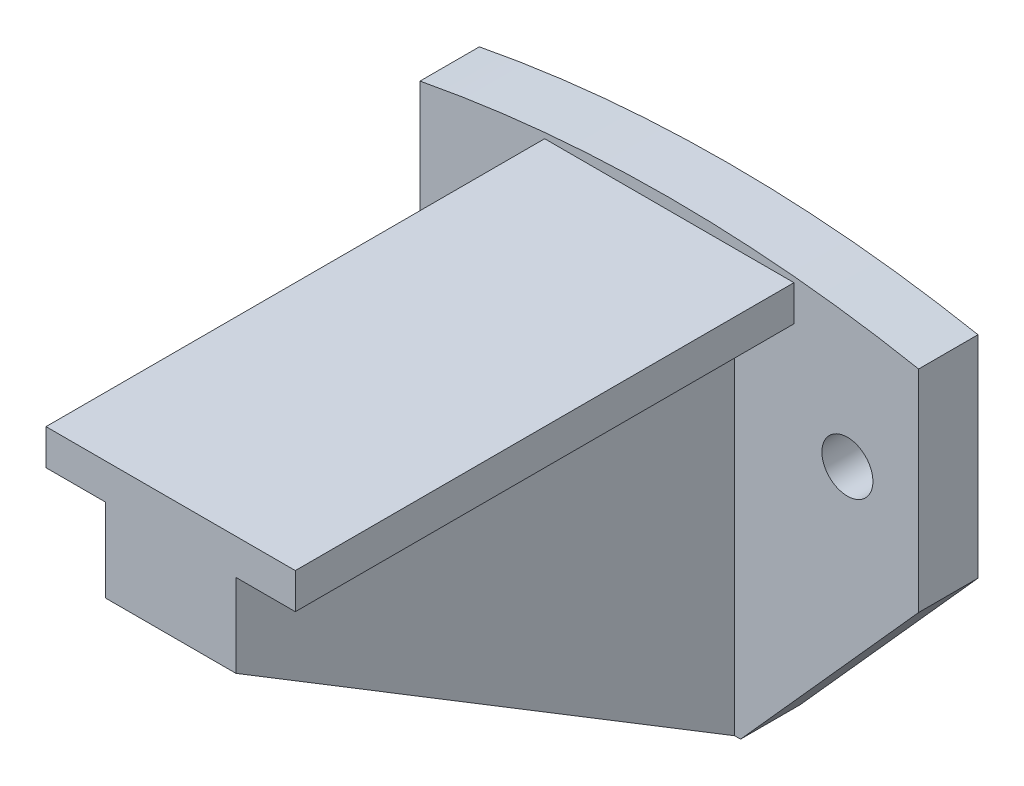
ISO-10303-21;
HEADER;
FILE_DESCRIPTION(('STEP AP214'),'2;1');
FILE_NAME('part.step','',(''),(''),'','','');
FILE_SCHEMA(('AUTOMOTIVE_DESIGN { 1 0 10303 214 1 1 1 1 }'));
ENDSEC;
DATA;
#1=APPLICATION_CONTEXT('core data for automotive mechanical design processes');
#2=APPLICATION_PROTOCOL_DEFINITION('international standard','automotive_design',2000,#1);
#3=PRODUCT_CONTEXT('',#1,'mechanical');
#4=PRODUCT('Part','Part','',(#3));
#5=PRODUCT_RELATED_PRODUCT_CATEGORY('part','',(#4));
#6=PRODUCT_DEFINITION_FORMATION('','',#4);
#7=PRODUCT_DEFINITION_CONTEXT('part definition',#1,'design');
#8=PRODUCT_DEFINITION('design','',#6,#7);
#9=PRODUCT_DEFINITION_SHAPE('','',#8);
#10=(LENGTH_UNIT() NAMED_UNIT(*) SI_UNIT(.MILLI.,.METRE.));
#11=(NAMED_UNIT(*) PLANE_ANGLE_UNIT() SI_UNIT($,.RADIAN.));
#12=(NAMED_UNIT(*) SI_UNIT($,.STERADIAN.) SOLID_ANGLE_UNIT());
#13=UNCERTAINTY_MEASURE_WITH_UNIT(LENGTH_MEASURE(1.E-05),#10,'distance_accuracy_value','');
#14=(GEOMETRIC_REPRESENTATION_CONTEXT(3) GLOBAL_UNCERTAINTY_ASSIGNED_CONTEXT((#13)) GLOBAL_UNIT_ASSIGNED_CONTEXT((#10,
#11,#12)) REPRESENTATION_CONTEXT('',''));
#15=CARTESIAN_POINT('',(0.,0.,0.));
#16=DIRECTION('',(0.,0.,1.));
#17=DIRECTION('',(1.,0.,0.));
#18=AXIS2_PLACEMENT_3D('',#15,#16,#17);
#19=CARTESIAN_POINT('',(0.,0.,0.));
#20=DIRECTION('',(0.,0.,-1.));
#21=DIRECTION('',(-1.,0.,0.));
#22=AXIS2_PLACEMENT_3D('',#19,#20,#21);
#23=PLANE('',#22);
#24=CARTESIAN_POINT('',(-15.,-4.37207546984478,0.));
#25=DIRECTION('',(0.,0.,-1.));
#26=DIRECTION('',(-1.,0.,0.));
#27=AXIS2_PLACEMENT_3D('',#24,#25,#26);
#28=CIRCLE('',#27,2.15);
#29=CARTESIAN_POINT('',(-17.15,-4.37207546984478,0.));
#30=VERTEX_POINT('',#29);
#31=EDGE_CURVE('E248',#30,#30,#28,.T.);
#32=ORIENTED_EDGE('',*,*,#31,.T.);
#33=EDGE_LOOP('',(#32));
#34=FACE_BOUND('',#33,.T.);
#35=DIRECTION('',(1.,0.,0.));
#36=VECTOR('',#35,1.);
#37=CARTESIAN_POINT('',(0.,-28.75,0.));
#38=LINE('',#37,#36);
#39=CARTESIAN_POINT('',(-6.,-28.75,0.));
#40=VERTEX_POINT('',#39);
#41=CARTESIAN_POINT('',(-5.49999999999963,-28.7500000000002,0.));
#42=VERTEX_POINT('',#41);
#43=EDGE_CURVE('E225',#40,#42,#38,.T.);
#44=ORIENTED_EDGE('',*,*,#43,.T.);
#45=DIRECTION('',(0.,-1.,0.));
#46=VECTOR('',#45,1.);
#47=CARTESIAN_POINT('',(-5.4999999999999,-3.20000000000006,0.));
#48=LINE('',#47,#46);
#49=CARTESIAN_POINT('',(-5.49999999999997,3.79999999999989,0.));
#50=VERTEX_POINT('',#49);
#51=EDGE_CURVE('E58',#50,#42,#48,.T.);
#52=ORIENTED_EDGE('',*,*,#51,.F.);
#53=DIRECTION('',(1.,0.,0.));
#54=VECTOR('',#53,1.);
#55=CARTESIAN_POINT('',(-5.49999999999997,3.79999999999989,0.));
#56=LINE('',#55,#54);
#57=CARTESIAN_POINT('',(-10.5,3.79999999999989,0.));
#58=VERTEX_POINT('',#57);
#59=EDGE_CURVE('E54',#58,#50,#56,.T.);
#60=ORIENTED_EDGE('',*,*,#59,.F.);
#61=DIRECTION('',(0.,-1.,0.));
#62=VECTOR('',#61,1.);
#63=CARTESIAN_POINT('',(-10.5,6.7999999999999,0.));
#64=LINE('',#63,#62);
#65=CARTESIAN_POINT('',(-10.5,6.7999999999999,0.));
#66=VERTEX_POINT('',#65);
#67=EDGE_CURVE('E11',#66,#58,#64,.T.);
#68=ORIENTED_EDGE('',*,*,#67,.F.);
#69=DIRECTION('',(-1.,0.,0.));
#70=VECTOR('',#69,1.);
#71=CARTESIAN_POINT('',(-10.5,6.7999999999999,0.));
#72=LINE('',#71,#70);
#73=CARTESIAN_POINT('',(10.5,6.7999999999999,0.));
#74=VERTEX_POINT('',#73);
#75=EDGE_CURVE('E203',#74,#66,#72,.T.);
#76=ORIENTED_EDGE('',*,*,#75,.F.);
#77=DIRECTION('',(0.,1.,0.));
#78=VECTOR('',#77,1.);
#79=CARTESIAN_POINT('',(10.5,6.7999999999999,0.));
#80=LINE('',#79,#78);
#81=CARTESIAN_POINT('',(10.5,3.79999999999989,0.));
#82=VERTEX_POINT('',#81);
#83=EDGE_CURVE('E201',#82,#74,#80,.T.);
#84=ORIENTED_EDGE('',*,*,#83,.F.);
#85=DIRECTION('',(1.,0.,0.));
#86=VECTOR('',#85,1.);
#87=CARTESIAN_POINT('',(10.5,3.79999999999989,0.));
#88=LINE('',#87,#86);
#89=CARTESIAN_POINT('',(5.5000000000001,3.79999999999989,0.));
#90=VERTEX_POINT('',#89);
#91=EDGE_CURVE('E198',#90,#82,#88,.T.);
#92=ORIENTED_EDGE('',*,*,#91,.F.);
#93=DIRECTION('',(0.,1.,0.));
#94=VECTOR('',#93,1.);
#95=CARTESIAN_POINT('',(5.5000000000001,3.79999999999989,0.));
#96=LINE('',#95,#94);
#97=CARTESIAN_POINT('',(5.5000000000004,-28.7500000000001,0.));
#98=VERTEX_POINT('',#97);
#99=EDGE_CURVE('E195',#98,#90,#96,.T.);
#100=ORIENTED_EDGE('',*,*,#99,.F.);
#101=CARTESIAN_POINT('',(6.,-28.75,0.));
#102=VERTEX_POINT('',#101);
#103=EDGE_CURVE('E224',#98,#102,#38,.T.);
#104=ORIENTED_EDGE('',*,*,#103,.T.);
#105=DIRECTION('',(-0.667272616939326,-0.744813570420776,0.));
#106=VECTOR('',#105,1.);
#107=CARTESIAN_POINT('',(17.6170524107622,-15.7829786294649,0.));
#108=LINE('',#107,#106);
#109=CARTESIAN_POINT('',(21.,-12.0069128828382,0.));
#110=VERTEX_POINT('',#109);
#111=EDGE_CURVE('E233',#110,#102,#108,.T.);
#112=ORIENTED_EDGE('',*,*,#111,.F.);
#113=DIRECTION('',(0.,1.,0.));
#114=VECTOR('',#113,1.);
#115=CARTESIAN_POINT('',(21.,0.,0.));
#116=LINE('',#115,#114);
#117=CARTESIAN_POINT('',(21.,5.75473761123897,0.));
#118=VERTEX_POINT('',#117);
#119=EDGE_CURVE('E146',#110,#118,#116,.T.);
#120=ORIENTED_EDGE('',*,*,#119,.T.);
#121=CARTESIAN_POINT('',(0.,-103.240675136271,0.));
#122=DIRECTION('',(0.,0.,-1.));
#123=DIRECTION('',(-1.,0.,0.));
#124=AXIS2_PLACEMENT_3D('',#121,#122,#123);
#125=CIRCLE('',#124,111.);
#126=CARTESIAN_POINT('',(-21.,5.75473761123897,0.));
#127=VERTEX_POINT('',#126);
#128=EDGE_CURVE('E153',#127,#118,#125,.T.);
#129=ORIENTED_EDGE('',*,*,#128,.F.);
#130=DIRECTION('',(0.,-1.,0.));
#131=VECTOR('',#130,1.);
#132=CARTESIAN_POINT('',(-21.,0.,0.));
#133=LINE('',#132,#131);
#134=CARTESIAN_POINT('',(-21.,-12.0069128828382,0.));
#135=VERTEX_POINT('',#134);
#136=EDGE_CURVE('E138',#127,#135,#133,.T.);
#137=ORIENTED_EDGE('',*,*,#136,.T.);
#138=DIRECTION('',(-0.667272616939325,0.744813570420776,0.));
#139=VECTOR('',#138,1.);
#140=CARTESIAN_POINT('',(-17.6170524107622,-15.7829786294649,0.));
#141=LINE('',#140,#139);
#142=EDGE_CURVE('E239',#40,#135,#141,.T.);
#143=ORIENTED_EDGE('',*,*,#142,.F.);
#144=EDGE_LOOP('',(#44,#52,#60,#68,#76,#84,#92,#100,#104,#112,#120,#129,#137,#143));
#145=FACE_BOUND('',#144,.T.);
#146=CARTESIAN_POINT('',(15.,-4.37207546984478,0.));
#147=DIRECTION('',(0.,0.,-1.));
#148=DIRECTION('',(-1.,0.,0.));
#149=AXIS2_PLACEMENT_3D('',#146,#147,#148);
#150=CIRCLE('',#149,2.15);
#151=CARTESIAN_POINT('',(12.85,-4.37207546984478,0.));
#152=VERTEX_POINT('',#151);
#153=EDGE_CURVE('E147',#152,#152,#150,.T.);
#154=ORIENTED_EDGE('',*,*,#153,.T.);
#155=EDGE_LOOP('',(#154));
#156=FACE_BOUND('',#155,.T.);
#157=ADVANCED_FACE('F37',(#34,#145,#156),#23,.F.);
#158=CARTESIAN_POINT('',(-21.,0.,-5.));
#159=DIRECTION('',(-1.,0.,0.));
#160=DIRECTION('',(0.,-1.,0.));
#161=AXIS2_PLACEMENT_3D('',#158,#159,#160);
#162=PLANE('',#161);
#163=DIRECTION('',(0.,-1.,0.));
#164=VECTOR('',#163,1.);
#165=CARTESIAN_POINT('',(-21.,0.,-5.));
#166=LINE('',#165,#164);
#167=CARTESIAN_POINT('',(-21.,5.75473761123897,-5.));
#168=VERTEX_POINT('',#167);
#169=CARTESIAN_POINT('',(-21.,-12.0069128828382,-5.00000000000003));
#170=VERTEX_POINT('',#169);
#171=EDGE_CURVE('E258',#168,#170,#166,.T.);
#172=ORIENTED_EDGE('',*,*,#171,.T.);
#173=DIRECTION('',(0.,0.,1.));
#174=VECTOR('',#173,1.);
#175=CARTESIAN_POINT('',(-21.,-12.0069128828382,-101.682227319325));
#176=LINE('',#175,#174);
#177=EDGE_CURVE('E143',#170,#135,#176,.T.);
#178=ORIENTED_EDGE('',*,*,#177,.T.);
#179=ORIENTED_EDGE('',*,*,#136,.F.);
#180=DIRECTION('',(0.,0.,-1.));
#181=VECTOR('',#180,1.);
#182=CARTESIAN_POINT('',(-21.,5.75473761123897,0.));
#183=LINE('',#182,#181);
#184=EDGE_CURVE('E141',#127,#168,#183,.T.);
#185=ORIENTED_EDGE('',*,*,#184,.T.);
#186=EDGE_LOOP('',(#172,#178,#179,#185));
#187=FACE_BOUND('',#186,.T.);
#188=ADVANCED_FACE('F39',(#187),#162,.T.);
#189=CARTESIAN_POINT('',(21.,0.,-5.));
#190=DIRECTION('',(1.,0.,0.));
#191=DIRECTION('',(0.,1.,0.));
#192=AXIS2_PLACEMENT_3D('',#189,#190,#191);
#193=PLANE('',#192);
#194=ORIENTED_EDGE('',*,*,#119,.F.);
#195=DIRECTION('',(0.,0.,1.));
#196=VECTOR('',#195,1.);
#197=CARTESIAN_POINT('',(21.,-12.0069128828382,-101.682227319325));
#198=LINE('',#197,#196);
#199=CARTESIAN_POINT('',(21.,-12.0069128828382,-5.00000000000003));
#200=VERTEX_POINT('',#199);
#201=EDGE_CURVE('E227',#200,#110,#198,.T.);
#202=ORIENTED_EDGE('',*,*,#201,.F.);
#203=DIRECTION('',(0.,1.,0.));
#204=VECTOR('',#203,1.);
#205=CARTESIAN_POINT('',(21.,0.,-5.));
#206=LINE('',#205,#204);
#207=CARTESIAN_POINT('',(21.,5.75473761123897,-5.));
#208=VERTEX_POINT('',#207);
#209=EDGE_CURVE('E260',#200,#208,#206,.T.);
#210=ORIENTED_EDGE('',*,*,#209,.T.);
#211=DIRECTION('',(0.,0.,-1.));
#212=VECTOR('',#211,1.);
#213=CARTESIAN_POINT('',(21.,5.75473761123897,0.));
#214=LINE('',#213,#212);
#215=EDGE_CURVE('E156',#118,#208,#214,.T.);
#216=ORIENTED_EDGE('',*,*,#215,.F.);
#217=EDGE_LOOP('',(#194,#202,#210,#216));
#218=FACE_BOUND('',#217,.T.);
#219=ADVANCED_FACE('F279',(#218),#193,.T.);
#220=CARTESIAN_POINT('',(0.,0.,-5.));
#221=DIRECTION('',(0.,0.,-1.));
#222=DIRECTION('',(-1.,0.,0.));
#223=AXIS2_PLACEMENT_3D('',#220,#221,#222);
#224=PLANE('',#223);
#225=CARTESIAN_POINT('',(0.,-23.2406751362707,-5.));
#226=DIRECTION('',(0.,0.,-1.));
#227=DIRECTION('',(-1.,0.,0.));
#228=AXIS2_PLACEMENT_3D('',#225,#226,#227);
#229=CIRCLE('',#228,2.15);
#230=CARTESIAN_POINT('',(-2.15,-23.2406751362707,-5.));
#231=VERTEX_POINT('',#230);
#232=EDGE_CURVE('E241',#231,#231,#229,.T.);
#233=ORIENTED_EDGE('',*,*,#232,.F.);
#234=EDGE_LOOP('',(#233));
#235=FACE_BOUND('',#234,.T.);
#236=CARTESIAN_POINT('',(-15.,-4.37207546984478,-5.));
#237=DIRECTION('',(0.,0.,-1.));
#238=DIRECTION('',(-1.,0.,0.));
#239=AXIS2_PLACEMENT_3D('',#236,#237,#238);
#240=CIRCLE('',#239,2.15);
#241=CARTESIAN_POINT('',(-17.15,-4.37207546984478,-5.));
#242=VERTEX_POINT('',#241);
#243=EDGE_CURVE('E247',#242,#242,#240,.T.);
#244=ORIENTED_EDGE('',*,*,#243,.F.);
#245=EDGE_LOOP('',(#244));
#246=FACE_BOUND('',#245,.T.);
#247=CARTESIAN_POINT('',(15.,-4.37207546984478,-5.));
#248=DIRECTION('',(0.,0.,-1.));
#249=DIRECTION('',(-1.,0.,0.));
#250=AXIS2_PLACEMENT_3D('',#247,#248,#249);
#251=CIRCLE('',#250,2.15);
#252=CARTESIAN_POINT('',(12.85,-4.37207546984478,-5.));
#253=VERTEX_POINT('',#252);
#254=EDGE_CURVE('E251',#253,#253,#251,.T.);
#255=ORIENTED_EDGE('',*,*,#254,.F.);
#256=EDGE_LOOP('',(#255));
#257=FACE_BOUND('',#256,.T.);
#258=DIRECTION('',(1.,0.,0.));
#259=VECTOR('',#258,1.);
#260=CARTESIAN_POINT('',(21.,-28.75,-5.));
#261=LINE('',#260,#259);
#262=CARTESIAN_POINT('',(-6.,-28.75,-5.));
#263=VERTEX_POINT('',#262);
#264=CARTESIAN_POINT('',(6.,-28.75,-5.00000000000003));
#265=VERTEX_POINT('',#264);
#266=EDGE_CURVE('E244',#263,#265,#261,.T.);
#267=ORIENTED_EDGE('',*,*,#266,.F.);
#268=DIRECTION('',(-0.667272616939325,0.744813570420776,0.));
#269=VECTOR('',#268,1.);
#270=CARTESIAN_POINT('',(-17.6170524107622,-15.7829786294649,-5.));
#271=LINE('',#270,#269);
#272=EDGE_CURVE('E236',#263,#170,#271,.T.);
#273=ORIENTED_EDGE('',*,*,#272,.T.);
#274=ORIENTED_EDGE('',*,*,#171,.F.);
#275=CARTESIAN_POINT('',(0.,-103.240675136271,-5.));
#276=DIRECTION('',(0.,0.,-1.));
#277=DIRECTION('',(-1.,0.,0.));
#278=AXIS2_PLACEMENT_3D('',#275,#276,#277);
#279=CIRCLE('',#278,111.);
#280=EDGE_CURVE('E155',#168,#208,#279,.T.);
#281=ORIENTED_EDGE('',*,*,#280,.T.);
#282=ORIENTED_EDGE('',*,*,#209,.F.);
#283=DIRECTION('',(-0.667272616939326,-0.744813570420776,0.));
#284=VECTOR('',#283,1.);
#285=CARTESIAN_POINT('',(17.6170524107622,-15.7829786294649,-5.));
#286=LINE('',#285,#284);
#287=EDGE_CURVE('E230',#200,#265,#286,.T.);
#288=ORIENTED_EDGE('',*,*,#287,.T.);
#289=EDGE_LOOP('',(#267,#273,#274,#281,#282,#288));
#290=FACE_BOUND('',#289,.T.);
#291=ADVANCED_FACE('F273',(#235,#246,#257,#290),#224,.T.);
#292=CARTESIAN_POINT('',(0.,-28.75,0.));
#293=DIRECTION('',(0.,-1.,0.));
#294=DIRECTION('',(1.,0.,0.));
#295=AXIS2_PLACEMENT_3D('',#292,#293,#294);
#296=PLANE('',#295);
#297=ORIENTED_EDGE('',*,*,#43,.F.);
#298=DIRECTION('',(0.,0.,-1.));
#299=VECTOR('',#298,1.);
#300=CARTESIAN_POINT('',(-6.,-28.75,0.));
#301=LINE('',#300,#299);
#302=EDGE_CURVE('E46',#40,#263,#301,.T.);
#303=ORIENTED_EDGE('',*,*,#302,.T.);
#304=ORIENTED_EDGE('',*,*,#266,.T.);
#305=DIRECTION('',(0.,0.,1.));
#306=VECTOR('',#305,1.);
#307=CARTESIAN_POINT('',(6.,-28.75,0.));
#308=LINE('',#307,#306);
#309=EDGE_CURVE('E261',#265,#102,#308,.T.);
#310=ORIENTED_EDGE('',*,*,#309,.T.);
#311=ORIENTED_EDGE('',*,*,#103,.F.);
#312=DIRECTION('',(1.,0.,0.));
#313=VECTOR('',#312,1.);
#314=CARTESIAN_POINT('',(-5.49999999999963,-28.7500000000002,0.));
#315=LINE('',#314,#313);
#316=EDGE_CURVE('E169',#42,#98,#315,.T.);
#317=ORIENTED_EDGE('',*,*,#316,.F.);
#318=EDGE_LOOP('',(#297,#303,#304,#310,#311,#317));
#319=FACE_BOUND('',#318,.T.);
#320=ADVANCED_FACE('F269',(#319),#296,.T.);
#321=CARTESIAN_POINT('',(15.,-4.37207546984478,0.));
#322=DIRECTION('',(0.,0.,-1.));
#323=DIRECTION('',(-1.,0.,0.));
#324=AXIS2_PLACEMENT_3D('',#321,#322,#323);
#325=CYLINDRICAL_SURFACE('',#324,2.15);
#326=ORIENTED_EDGE('',*,*,#153,.F.);
#327=EDGE_LOOP('',(#326));
#328=FACE_BOUND('',#327,.T.);
#329=ORIENTED_EDGE('',*,*,#254,.T.);
#330=EDGE_LOOP('',(#329));
#331=FACE_BOUND('',#330,.T.);
#332=ADVANCED_FACE('F293',(#328,#331),#325,.F.);
#333=CARTESIAN_POINT('',(-15.,-4.37207546984478,0.));
#334=DIRECTION('',(0.,0.,-1.));
#335=DIRECTION('',(-1.,0.,0.));
#336=AXIS2_PLACEMENT_3D('',#333,#334,#335);
#337=CYLINDRICAL_SURFACE('',#336,2.15);
#338=ORIENTED_EDGE('',*,*,#31,.F.);
#339=EDGE_LOOP('',(#338));
#340=FACE_BOUND('',#339,.T.);
#341=ORIENTED_EDGE('',*,*,#243,.T.);
#342=EDGE_LOOP('',(#341));
#343=FACE_BOUND('',#342,.T.);
#344=ADVANCED_FACE('F296',(#340,#343),#337,.F.);
#345=CARTESIAN_POINT('',(0.,-23.2406751362707,23.));
#346=DIRECTION('',(0.,0.,-1.));
#347=DIRECTION('',(-1.,0.,0.));
#348=AXIS2_PLACEMENT_3D('',#345,#346,#347);
#349=CYLINDRICAL_SURFACE('',#348,2.15);
#350=ORIENTED_EDGE('',*,*,#232,.T.);
#351=EDGE_LOOP('',(#350));
#352=FACE_BOUND('',#351,.T.);
#353=CARTESIAN_POINT('',(0.,-23.2406751362707,9.05642443352776));
#354=DIRECTION('',(0.,-0.85433600511186,0.519721069776383));
#355=DIRECTION('',(0.,-0.519721069776383,-0.85433600511186));
#356=AXIS2_PLACEMENT_3D('',#353,#354,#355);
#357=ELLIPSE('',#356,4.13683440027757,2.15);
#358=CARTESIAN_POINT('',(0.,-25.3906751362707,5.5221778581853));
#359=VERTEX_POINT('',#358);
#360=EDGE_CURVE('E41',#359,#359,#357,.T.);
#361=ORIENTED_EDGE('',*,*,#360,.T.);
#362=EDGE_LOOP('',(#361));
#363=FACE_BOUND('',#362,.T.);
#364=ADVANCED_FACE('F300',(#352,#363),#349,.F.);
#365=CARTESIAN_POINT('',(6.,-28.75,-101.682227319325));
#366=DIRECTION('',(0.744813570420776,-0.667272616939325,0.));
#367=DIRECTION('',(0.667272616939326,0.744813570420776,0.));
#368=AXIS2_PLACEMENT_3D('',#365,#366,#367);
#369=PLANE('',#368);
#370=ORIENTED_EDGE('',*,*,#201,.T.);
#371=ORIENTED_EDGE('',*,*,#111,.T.);
#372=ORIENTED_EDGE('',*,*,#309,.F.);
#373=ORIENTED_EDGE('',*,*,#287,.F.);
#374=EDGE_LOOP('',(#370,#371,#372,#373));
#375=FACE_BOUND('',#374,.T.);
#376=ADVANCED_FACE('F277',(#375),#369,.T.);
#377=CARTESIAN_POINT('',(-21.,-12.0069128828382,-101.682227319325));
#378=DIRECTION('',(-0.744813570420776,-0.667272616939325,0.));
#379=DIRECTION('',(0.667272616939325,-0.744813570420776,0.));
#380=AXIS2_PLACEMENT_3D('',#377,#378,#379);
#381=PLANE('',#380);
#382=ORIENTED_EDGE('',*,*,#302,.F.);
#383=ORIENTED_EDGE('',*,*,#142,.T.);
#384=ORIENTED_EDGE('',*,*,#177,.F.);
#385=ORIENTED_EDGE('',*,*,#272,.F.);
#386=EDGE_LOOP('',(#382,#383,#384,#385));
#387=FACE_BOUND('',#386,.T.);
#388=ADVANCED_FACE('F307',(#387),#381,.T.);
#389=CARTESIAN_POINT('',(-5.4999999999999,-3.20000000000006,42.));
#390=DIRECTION('',(1.,0.,0.));
#391=DIRECTION('',(0.,1.,0.));
#392=AXIS2_PLACEMENT_3D('',#389,#390,#391);
#393=PLANE('',#392);
#394=ORIENTED_EDGE('',*,*,#51,.T.);
#395=DIRECTION('',(0.,-0.519721069776383,-0.85433600511186));
#396=VECTOR('',#395,1.);
#397=CARTESIAN_POINT('',(-5.49999999999963,-28.7500000000002,0.));
#398=LINE('',#397,#396);
#399=CARTESIAN_POINT('',(-5.4999999999999,-3.20000000000008,42.));
#400=VERTEX_POINT('',#399);
#401=EDGE_CURVE('E166',#400,#42,#398,.T.);
#402=ORIENTED_EDGE('',*,*,#401,.F.);
#403=DIRECTION('',(0.,-1.,0.));
#404=VECTOR('',#403,1.);
#405=CARTESIAN_POINT('',(-5.4999999999999,-3.20000000000006,42.));
#406=LINE('',#405,#404);
#407=CARTESIAN_POINT('',(-5.49999999999997,3.79999999999989,42.));
#408=VERTEX_POINT('',#407);
#409=EDGE_CURVE('E175',#408,#400,#406,.T.);
#410=ORIENTED_EDGE('',*,*,#409,.F.);
#411=DIRECTION('',(0.,0.,-1.));
#412=VECTOR('',#411,1.);
#413=CARTESIAN_POINT('',(-5.49999999999997,3.79999999999989,42.));
#414=LINE('',#413,#412);
#415=EDGE_CURVE('E193',#408,#50,#414,.T.);
#416=ORIENTED_EDGE('',*,*,#415,.T.);
#417=EDGE_LOOP('',(#394,#402,#410,#416));
#418=FACE_BOUND('',#417,.T.);
#419=ADVANCED_FACE('F310',(#418),#393,.F.);
#420=CARTESIAN_POINT('',(5.5000000000001,3.79999999999989,42.));
#421=DIRECTION('',(-1.,0.,0.));
#422=DIRECTION('',(0.,0.,1.));
#423=AXIS2_PLACEMENT_3D('',#420,#421,#422);
#424=PLANE('',#423);
#425=ORIENTED_EDGE('',*,*,#99,.T.);
#426=DIRECTION('',(0.,0.,-1.));
#427=VECTOR('',#426,1.);
#428=CARTESIAN_POINT('',(5.5000000000001,3.79999999999989,42.));
#429=LINE('',#428,#427);
#430=CARTESIAN_POINT('',(5.5000000000001,3.79999999999989,42.));
#431=VERTEX_POINT('',#430);
#432=EDGE_CURVE('E221',#431,#90,#429,.T.);
#433=ORIENTED_EDGE('',*,*,#432,.F.);
#434=DIRECTION('',(0.,1.,0.));
#435=VECTOR('',#434,1.);
#436=CARTESIAN_POINT('',(5.5000000000001,3.79999999999989,42.));
#437=LINE('',#436,#435);
#438=CARTESIAN_POINT('',(5.5000000000001,-3.20000000000006,42.));
#439=VERTEX_POINT('',#438);
#440=EDGE_CURVE('E181',#439,#431,#437,.T.);
#441=ORIENTED_EDGE('',*,*,#440,.F.);
#442=DIRECTION('',(0.,-0.519721069776383,-0.85433600511186));
#443=VECTOR('',#442,1.);
#444=CARTESIAN_POINT('',(5.5000000000004,-28.7500000000001,0.));
#445=LINE('',#444,#443);
#446=EDGE_CURVE('E170',#439,#98,#445,.T.);
#447=ORIENTED_EDGE('',*,*,#446,.T.);
#448=EDGE_LOOP('',(#425,#433,#441,#447));
#449=FACE_BOUND('',#448,.T.);
#450=ADVANCED_FACE('F315',(#449),#424,.F.);
#451=CARTESIAN_POINT('',(10.5,3.79999999999989,42.));
#452=DIRECTION('',(0.,1.,0.));
#453=DIRECTION('',(0.,0.,1.));
#454=AXIS2_PLACEMENT_3D('',#451,#452,#453);
#455=PLANE('',#454);
#456=ORIENTED_EDGE('',*,*,#91,.T.);
#457=DIRECTION('',(0.,0.,-1.));
#458=VECTOR('',#457,1.);
#459=CARTESIAN_POINT('',(10.5,3.79999999999989,42.));
#460=LINE('',#459,#458);
#461=CARTESIAN_POINT('',(10.5,3.79999999999989,42.));
#462=VERTEX_POINT('',#461);
#463=EDGE_CURVE('E218',#462,#82,#460,.T.);
#464=ORIENTED_EDGE('',*,*,#463,.F.);
#465=DIRECTION('',(1.,0.,0.));
#466=VECTOR('',#465,1.);
#467=CARTESIAN_POINT('',(10.5,3.79999999999989,42.));
#468=LINE('',#467,#466);
#469=EDGE_CURVE('E183',#431,#462,#468,.T.);
#470=ORIENTED_EDGE('',*,*,#469,.F.);
#471=ORIENTED_EDGE('',*,*,#432,.T.);
#472=EDGE_LOOP('',(#456,#464,#470,#471));
#473=FACE_BOUND('',#472,.T.);
#474=ADVANCED_FACE('F319',(#473),#455,.F.);
#475=CARTESIAN_POINT('',(10.5,6.7999999999999,42.));
#476=DIRECTION('',(-1.,0.,0.));
#477=DIRECTION('',(0.,0.,1.));
#478=AXIS2_PLACEMENT_3D('',#475,#476,#477);
#479=PLANE('',#478);
#480=ORIENTED_EDGE('',*,*,#83,.T.);
#481=DIRECTION('',(0.,0.,-1.));
#482=VECTOR('',#481,1.);
#483=CARTESIAN_POINT('',(10.5,6.7999999999999,42.));
#484=LINE('',#483,#482);
#485=CARTESIAN_POINT('',(10.5,6.7999999999999,42.));
#486=VERTEX_POINT('',#485);
#487=EDGE_CURVE('E215',#486,#74,#484,.T.);
#488=ORIENTED_EDGE('',*,*,#487,.F.);
#489=DIRECTION('',(0.,1.,0.));
#490=VECTOR('',#489,1.);
#491=CARTESIAN_POINT('',(10.5,6.7999999999999,42.));
#492=LINE('',#491,#490);
#493=EDGE_CURVE('E185',#462,#486,#492,.T.);
#494=ORIENTED_EDGE('',*,*,#493,.F.);
#495=ORIENTED_EDGE('',*,*,#463,.T.);
#496=EDGE_LOOP('',(#480,#488,#494,#495));
#497=FACE_BOUND('',#496,.T.);
#498=ADVANCED_FACE('F323',(#497),#479,.F.);
#499=CARTESIAN_POINT('',(-10.5,6.7999999999999,42.));
#500=DIRECTION('',(0.,-1.,0.));
#501=DIRECTION('',(0.,0.,-1.));
#502=AXIS2_PLACEMENT_3D('',#499,#500,#501);
#503=PLANE('',#502);
#504=ORIENTED_EDGE('',*,*,#75,.T.);
#505=DIRECTION('',(0.,0.,-1.));
#506=VECTOR('',#505,1.);
#507=CARTESIAN_POINT('',(-10.5,6.7999999999999,42.));
#508=LINE('',#507,#506);
#509=CARTESIAN_POINT('',(-10.5,6.7999999999999,42.));
#510=VERTEX_POINT('',#509);
#511=EDGE_CURVE('E212',#510,#66,#508,.T.);
#512=ORIENTED_EDGE('',*,*,#511,.F.);
#513=DIRECTION('',(-1.,0.,0.));
#514=VECTOR('',#513,1.);
#515=CARTESIAN_POINT('',(-10.5,6.7999999999999,42.));
#516=LINE('',#515,#514);
#517=EDGE_CURVE('E187',#486,#510,#516,.T.);
#518=ORIENTED_EDGE('',*,*,#517,.F.);
#519=ORIENTED_EDGE('',*,*,#487,.T.);
#520=EDGE_LOOP('',(#504,#512,#518,#519));
#521=FACE_BOUND('',#520,.T.);
#522=ADVANCED_FACE('F327',(#521),#503,.F.);
#523=CARTESIAN_POINT('',(-10.5,6.7999999999999,42.));
#524=DIRECTION('',(1.,0.,0.));
#525=DIRECTION('',(0.,1.,0.));
#526=AXIS2_PLACEMENT_3D('',#523,#524,#525);
#527=PLANE('',#526);
#528=ORIENTED_EDGE('',*,*,#511,.T.);
#529=ORIENTED_EDGE('',*,*,#67,.T.);
#530=DIRECTION('',(0.,0.,-1.));
#531=VECTOR('',#530,1.);
#532=CARTESIAN_POINT('',(-10.5,3.79999999999989,42.));
#533=LINE('',#532,#531);
#534=CARTESIAN_POINT('',(-10.5,3.79999999999989,42.));
#535=VERTEX_POINT('',#534);
#536=EDGE_CURVE('E209',#535,#58,#533,.T.);
#537=ORIENTED_EDGE('',*,*,#536,.F.);
#538=DIRECTION('',(0.,-1.,0.));
#539=VECTOR('',#538,1.);
#540=CARTESIAN_POINT('',(-10.5,6.7999999999999,42.));
#541=LINE('',#540,#539);
#542=EDGE_CURVE('E189',#510,#535,#541,.T.);
#543=ORIENTED_EDGE('',*,*,#542,.F.);
#544=EDGE_LOOP('',(#528,#529,#537,#543));
#545=FACE_BOUND('',#544,.T.);
#546=ADVANCED_FACE('F331',(#545),#527,.F.);
#547=CARTESIAN_POINT('',(-5.49999999999997,3.79999999999989,42.));
#548=DIRECTION('',(0.,1.,0.));
#549=DIRECTION('',(-1.,0.,0.));
#550=AXIS2_PLACEMENT_3D('',#547,#548,#549);
#551=PLANE('',#550);
#552=ORIENTED_EDGE('',*,*,#59,.T.);
#553=ORIENTED_EDGE('',*,*,#415,.F.);
#554=DIRECTION('',(1.,0.,0.));
#555=VECTOR('',#554,1.);
#556=CARTESIAN_POINT('',(-5.49999999999997,3.79999999999989,42.));
#557=LINE('',#556,#555);
#558=EDGE_CURVE('E191',#535,#408,#557,.T.);
#559=ORIENTED_EDGE('',*,*,#558,.F.);
#560=ORIENTED_EDGE('',*,*,#536,.T.);
#561=EDGE_LOOP('',(#552,#553,#559,#560));
#562=FACE_BOUND('',#561,.T.);
#563=ADVANCED_FACE('F335',(#562),#551,.F.);
#564=CARTESIAN_POINT('',(0.,0.,42.));
#565=DIRECTION('',(0.,0.,1.));
#566=DIRECTION('',(1.,0.,0.));
#567=AXIS2_PLACEMENT_3D('',#564,#565,#566);
#568=PLANE('',#567);
#569=ORIENTED_EDGE('',*,*,#409,.T.);
#570=DIRECTION('',(1.,0.,0.));
#571=VECTOR('',#570,1.);
#572=CARTESIAN_POINT('',(-5.4999999999999,-3.20000000000006,42.));
#573=LINE('',#572,#571);
#574=EDGE_CURVE('E178',#400,#439,#573,.T.);
#575=ORIENTED_EDGE('',*,*,#574,.T.);
#576=ORIENTED_EDGE('',*,*,#440,.T.);
#577=ORIENTED_EDGE('',*,*,#469,.T.);
#578=ORIENTED_EDGE('',*,*,#493,.T.);
#579=ORIENTED_EDGE('',*,*,#517,.T.);
#580=ORIENTED_EDGE('',*,*,#542,.T.);
#581=ORIENTED_EDGE('',*,*,#558,.T.);
#582=EDGE_LOOP('',(#569,#575,#576,#577,#578,#579,#580,#581));
#583=FACE_BOUND('',#582,.T.);
#584=ADVANCED_FACE('F339',(#583),#568,.T.);
#585=CARTESIAN_POINT('',(-5.49999999999963,-28.7500000000002,0.));
#586=DIRECTION('',(0.,-0.85433600511186,0.519721069776383));
#587=DIRECTION('',(0.,-0.519721069776383,-0.85433600511186));
#588=AXIS2_PLACEMENT_3D('',#585,#586,#587);
#589=PLANE('',#588);
#590=ORIENTED_EDGE('',*,*,#360,.F.);
#591=EDGE_LOOP('',(#590));
#592=FACE_BOUND('',#591,.T.);
#593=ORIENTED_EDGE('',*,*,#446,.F.);
#594=ORIENTED_EDGE('',*,*,#574,.F.);
#595=ORIENTED_EDGE('',*,*,#401,.T.);
#596=ORIENTED_EDGE('',*,*,#316,.T.);
#597=EDGE_LOOP('',(#593,#594,#595,#596));
#598=FACE_BOUND('',#597,.T.);
#599=ADVANCED_FACE('F343',(#592,#598),#589,.T.);
#600=CARTESIAN_POINT('',(0.,-103.240675136271,0.));
#601=DIRECTION('',(0.,0.,-1.));
#602=DIRECTION('',(-1.,0.,0.));
#603=AXIS2_PLACEMENT_3D('',#600,#601,#602);
#604=CYLINDRICAL_SURFACE('',#603,111.);
#605=ORIENTED_EDGE('',*,*,#280,.F.);
#606=ORIENTED_EDGE('',*,*,#184,.F.);
#607=ORIENTED_EDGE('',*,*,#128,.T.);
#608=ORIENTED_EDGE('',*,*,#215,.T.);
#609=EDGE_LOOP('',(#605,#606,#607,#608));
#610=FACE_BOUND('',#609,.T.);
#611=ADVANCED_FACE('F151',(#610),#604,.T.);
#612=CLOSED_SHELL('',(#157,#188,#219,#291,#320,#332,#344,#364,#376,#388,#419,#450,#474,#498,
#522,#546,#563,#584,#599,#611));
#613=MANIFOLD_SOLID_BREP('B2',#612);
#614=ADVANCED_BREP_SHAPE_REPRESENTATION('',(#18,#613),#14);
#615=SHAPE_DEFINITION_REPRESENTATION(#9,#614);
ENDSEC;
END-ISO-10303-21;
